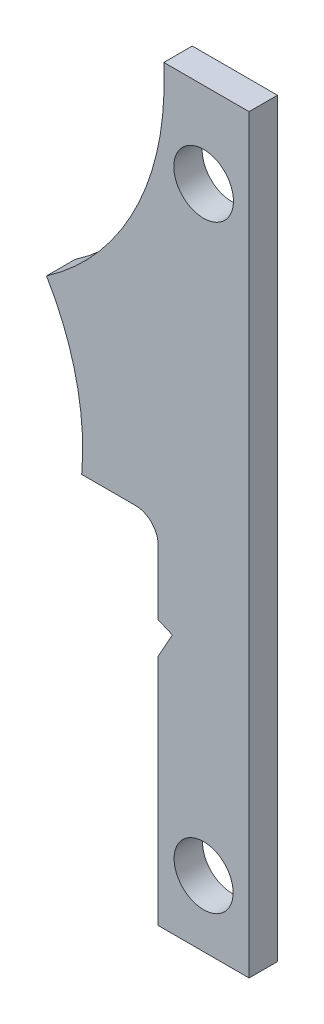
ISO-10303-21;
HEADER;
FILE_DESCRIPTION(('STEP AP214'),'2;1');
FILE_NAME('part.step','',(''),(''),'','','');
FILE_SCHEMA(('AUTOMOTIVE_DESIGN { 1 0 10303 214 1 1 1 1 }'));
ENDSEC;
DATA;
#1=APPLICATION_CONTEXT('core data for automotive mechanical design processes');
#2=APPLICATION_PROTOCOL_DEFINITION('international standard','automotive_design',2000,#1);
#3=PRODUCT_CONTEXT('',#1,'mechanical');
#4=PRODUCT('Part','Part','',(#3));
#5=PRODUCT_RELATED_PRODUCT_CATEGORY('part','',(#4));
#6=PRODUCT_DEFINITION_FORMATION('','',#4);
#7=PRODUCT_DEFINITION_CONTEXT('part definition',#1,'design');
#8=PRODUCT_DEFINITION('design','',#6,#7);
#9=PRODUCT_DEFINITION_SHAPE('','',#8);
#10=(LENGTH_UNIT() NAMED_UNIT(*) SI_UNIT(.MILLI.,.METRE.));
#11=(NAMED_UNIT(*) PLANE_ANGLE_UNIT() SI_UNIT($,.RADIAN.));
#12=(NAMED_UNIT(*) SI_UNIT($,.STERADIAN.) SOLID_ANGLE_UNIT());
#13=UNCERTAINTY_MEASURE_WITH_UNIT(LENGTH_MEASURE(1.E-05),#10,'distance_accuracy_value','');
#14=(GEOMETRIC_REPRESENTATION_CONTEXT(3) GLOBAL_UNCERTAINTY_ASSIGNED_CONTEXT((#13)) GLOBAL_UNIT_ASSIGNED_CONTEXT((#10,
#11,#12)) REPRESENTATION_CONTEXT('',''));
#15=CARTESIAN_POINT('',(0.,0.,0.));
#16=DIRECTION('',(0.,0.,1.));
#17=DIRECTION('',(1.,0.,0.));
#18=AXIS2_PLACEMENT_3D('',#15,#16,#17);
#19=CARTESIAN_POINT('',(795.076378776782,63.8094152835061,5.));
#20=DIRECTION('',(0.,0.,1.));
#21=DIRECTION('',(1.,0.,0.));
#22=AXIS2_PLACEMENT_3D('',#19,#20,#21);
#23=PLANE('',#22);
#24=CARTESIAN_POINT('',(795.076378776782,63.8094152835061,5.));
#25=DIRECTION('',(0.,0.,1.));
#26=DIRECTION('',(1.,0.,0.));
#27=AXIS2_PLACEMENT_3D('',#24,#25,#26);
#28=CIRCLE('',#27,45.25);
#29=CARTESIAN_POINT('',(840.148400329433,59.8000047087006,5.));
#30=VERTEX_POINT('',#29);
#31=CARTESIAN_POINT('',(833.960496434744,86.9521872428422,5.));
#32=VERTEX_POINT('',#31);
#33=EDGE_CURVE('E47',#30,#32,#28,.T.);
#34=ORIENTED_EDGE('',*,*,#33,.F.);
#35=DIRECTION('',(1.,0.,0.));
#36=VECTOR('',#35,1.);
#37=CARTESIAN_POINT('',(820.028101645404,59.8000047086987,5.));
#38=LINE('',#37,#36);
#39=CARTESIAN_POINT('',(849.600001490012,59.8000047087015,5.));
#40=VERTEX_POINT('',#39);
#41=EDGE_CURVE('E101',#30,#40,#38,.T.);
#42=ORIENTED_EDGE('',*,*,#41,.T.);
#43=CARTESIAN_POINT('',(849.600001490012,55.8000047087015,5.));
#44=DIRECTION('',(0.,0.,-1.));
#45=DIRECTION('',(1.,0.,0.));
#46=AXIS2_PLACEMENT_3D('',#43,#44,#45);
#47=CIRCLE('',#46,4.);
#48=CARTESIAN_POINT('',(853.600001490012,55.8000047087015,5.));
#49=VERTEX_POINT('',#48);
#50=EDGE_CURVE('E198',#40,#49,#47,.T.);
#51=ORIENTED_EDGE('',*,*,#50,.T.);
#52=DIRECTION('',(0.,-1.,0.));
#53=VECTOR('',#52,1.);
#54=CARTESIAN_POINT('',(853.600001490012,55.8000047087015,5.));
#55=LINE('',#54,#53);
#56=CARTESIAN_POINT('',(853.600001490012,44.4001544028015,5.));
#57=VERTEX_POINT('',#56);
#58=EDGE_CURVE('E220',#49,#57,#55,.T.);
#59=ORIENTED_EDGE('',*,*,#58,.T.);
#60=DIRECTION('',(0.915294684400679,-0.402784856601961,0.));
#61=VECTOR('',#60,1.);
#62=CARTESIAN_POINT('',(853.600001490012,44.4001544028015,5.));
#63=LINE('',#62,#61);
#64=CARTESIAN_POINT('',(856.099999798813,43.3000043883015,5.));
#65=VERTEX_POINT('',#64);
#66=EDGE_CURVE('E217',#57,#65,#63,.T.);
#67=ORIENTED_EDGE('',*,*,#66,.T.);
#68=DIRECTION('',(-0.488075249911389,-0.872801552716272,0.));
#69=VECTOR('',#68,1.);
#70=CARTESIAN_POINT('',(856.099999798813,43.3000043883015,5.));
#71=LINE('',#70,#69);
#72=CARTESIAN_POINT('',(853.600001490012,38.8293773567015,5.));
#73=VERTEX_POINT('',#72);
#74=EDGE_CURVE('E219',#65,#73,#71,.T.);
#75=ORIENTED_EDGE('',*,*,#74,.T.);
#76=DIRECTION('',(0.,-1.,0.));
#77=VECTOR('',#76,1.);
#78=CARTESIAN_POINT('',(853.600001490012,38.8293773567015,5.));
#79=LINE('',#78,#77);
#80=CARTESIAN_POINT('',(853.600001490012,-2.19999390319852,5.));
#81=VERTEX_POINT('',#80);
#82=EDGE_CURVE('E222',#73,#81,#79,.T.);
#83=ORIENTED_EDGE('',*,*,#82,.T.);
#84=DIRECTION('',(1.,0.,0.));
#85=VECTOR('',#84,1.);
#86=CARTESIAN_POINT('',(853.600001490012,-2.19999390319852,5.));
#87=LINE('',#86,#85);
#88=CARTESIAN_POINT('',(869.600000000013,-2.19999390319852,5.));
#89=VERTEX_POINT('',#88);
#90=EDGE_CURVE('E130',#81,#89,#87,.T.);
#91=ORIENTED_EDGE('',*,*,#90,.T.);
#92=DIRECTION('',(0.,1.,0.));
#93=VECTOR('',#92,1.);
#94=CARTESIAN_POINT('',(869.600000000013,-2.19999390319852,5.));
#95=LINE('',#94,#93);
#96=CARTESIAN_POINT('',(869.600000000013,129.800004708701,5.));
#97=VERTEX_POINT('',#96);
#98=EDGE_CURVE('E123',#89,#97,#95,.T.);
#99=ORIENTED_EDGE('',*,*,#98,.T.);
#100=DIRECTION('',(-1.,0.,0.));
#101=VECTOR('',#100,1.);
#102=CARTESIAN_POINT('',(869.600000000013,129.800004708701,5.));
#103=LINE('',#102,#101);
#104=CARTESIAN_POINT('',(854.600000000013,129.800004708701,5.));
#105=VERTEX_POINT('',#104);
#106=EDGE_CURVE('E127',#97,#105,#103,.T.);
#107=ORIENTED_EDGE('',*,*,#106,.T.);
#108=DIRECTION('',(0.,-1.,0.));
#109=VECTOR('',#108,1.);
#110=CARTESIAN_POINT('',(854.600000000013,129.800004708701,5.));
#111=LINE('',#110,#109);
#112=CARTESIAN_POINT('',(854.600000000013,124.800004708701,5.));
#113=VERTEX_POINT('',#112);
#114=EDGE_CURVE('E55',#105,#113,#111,.T.);
#115=ORIENTED_EDGE('',*,*,#114,.T.);
#116=CARTESIAN_POINT('',(806.723142878147,126.35706585599,5.));
#117=DIRECTION('',(0.,0.,-1.));
#118=DIRECTION('',(1.,0.,0.));
#119=AXIS2_PLACEMENT_3D('',#116,#117,#118);
#120=CIRCLE('',#119,47.9021699642505);
#121=EDGE_CURVE('E147',#113,#32,#120,.T.);
#122=ORIENTED_EDGE('',*,*,#121,.T.);
#123=EDGE_LOOP('',(#34,#42,#51,#59,#67,#75,#83,#91,#99,#107,#115,#122));
#124=FACE_BOUND('',#123,.T.);
#125=CARTESIAN_POINT('',(861.600000000013,9.39149717140147,5.));
#126=DIRECTION('',(0.,0.,1.));
#127=DIRECTION('',(1.,0.,0.));
#128=AXIS2_PLACEMENT_3D('',#125,#126,#127);
#129=CIRCLE('',#128,5.19190313570428);
#130=CARTESIAN_POINT('',(866.791903135717,9.39149717140147,5.));
#131=VERTEX_POINT('',#130);
#132=EDGE_CURVE('E156',#131,#131,#129,.T.);
#133=ORIENTED_EDGE('',*,*,#132,.F.);
#134=EDGE_LOOP('',(#133));
#135=FACE_BOUND('',#134,.T.);
#136=CARTESIAN_POINT('',(861.600000000013,114.800004708701,5.));
#137=DIRECTION('',(0.,0.,1.));
#138=DIRECTION('',(1.,0.,0.));
#139=AXIS2_PLACEMENT_3D('',#136,#137,#138);
#140=CIRCLE('',#139,5.24999999999987);
#141=CARTESIAN_POINT('',(866.850000000012,114.800004708701,5.));
#142=VERTEX_POINT('',#141);
#143=EDGE_CURVE('E250',#142,#142,#140,.T.);
#144=ORIENTED_EDGE('',*,*,#143,.F.);
#145=EDGE_LOOP('',(#144));
#146=FACE_BOUND('',#145,.T.);
#147=ADVANCED_FACE('F32',(#124,#135,#146),#23,.T.);
#148=CARTESIAN_POINT('',(795.076378776782,63.8094152835061,0.));
#149=DIRECTION('',(0.,0.,1.));
#150=DIRECTION('',(1.,0.,0.));
#151=AXIS2_PLACEMENT_3D('',#148,#149,#150);
#152=PLANE('',#151);
#153=DIRECTION('',(1.,0.,0.));
#154=VECTOR('',#153,1.);
#155=CARTESIAN_POINT('',(820.028101645404,59.8000047086987,0.));
#156=LINE('',#155,#154);
#157=CARTESIAN_POINT('',(840.148400329433,59.8000047087006,0.));
#158=VERTEX_POINT('',#157);
#159=CARTESIAN_POINT('',(849.600001490012,59.8000047087015,0.));
#160=VERTEX_POINT('',#159);
#161=EDGE_CURVE('E153',#158,#160,#156,.T.);
#162=ORIENTED_EDGE('',*,*,#161,.F.);
#163=CARTESIAN_POINT('',(795.076378776782,63.8094152835061,0.));
#164=DIRECTION('',(0.,0.,-1.));
#165=DIRECTION('',(-1.,0.,0.));
#166=AXIS2_PLACEMENT_3D('',#163,#164,#165);
#167=CIRCLE('',#166,45.25);
#168=CARTESIAN_POINT('',(833.960496434744,86.9521872428422,0.));
#169=VERTEX_POINT('',#168);
#170=EDGE_CURVE('E242',#169,#158,#167,.T.);
#171=ORIENTED_EDGE('',*,*,#170,.F.);
#172=CARTESIAN_POINT('',(806.723142878147,126.35706585599,0.));
#173=DIRECTION('',(0.,0.,-1.));
#174=DIRECTION('',(1.,0.,0.));
#175=AXIS2_PLACEMENT_3D('',#172,#173,#174);
#176=CIRCLE('',#175,47.9021699642505);
#177=CARTESIAN_POINT('',(854.600000000013,124.800004708701,0.));
#178=VERTEX_POINT('',#177);
#179=EDGE_CURVE('E172',#178,#169,#176,.T.);
#180=ORIENTED_EDGE('',*,*,#179,.F.);
#181=DIRECTION('',(0.,-1.,0.));
#182=VECTOR('',#181,1.);
#183=CARTESIAN_POINT('',(854.600000000013,129.800004708701,0.));
#184=LINE('',#183,#182);
#185=CARTESIAN_POINT('',(854.600000000013,129.800004708701,0.));
#186=VERTEX_POINT('',#185);
#187=EDGE_CURVE('E94',#186,#178,#184,.T.);
#188=ORIENTED_EDGE('',*,*,#187,.F.);
#189=DIRECTION('',(-1.,0.,0.));
#190=VECTOR('',#189,1.);
#191=CARTESIAN_POINT('',(869.600000000013,129.800004708701,0.));
#192=LINE('',#191,#190);
#193=CARTESIAN_POINT('',(869.600000000013,129.800004708701,0.));
#194=VERTEX_POINT('',#193);
#195=EDGE_CURVE('E169',#194,#186,#192,.T.);
#196=ORIENTED_EDGE('',*,*,#195,.F.);
#197=DIRECTION('',(0.,1.,0.));
#198=VECTOR('',#197,1.);
#199=CARTESIAN_POINT('',(869.600000000013,-2.19999390319852,0.));
#200=LINE('',#199,#198);
#201=CARTESIAN_POINT('',(869.600000000013,-2.19999390319852,0.));
#202=VERTEX_POINT('',#201);
#203=EDGE_CURVE('E139',#202,#194,#200,.T.);
#204=ORIENTED_EDGE('',*,*,#203,.F.);
#205=DIRECTION('',(1.,0.,0.));
#206=VECTOR('',#205,1.);
#207=CARTESIAN_POINT('',(853.600001490012,-2.19999390319852,0.));
#208=LINE('',#207,#206);
#209=CARTESIAN_POINT('',(853.600001490012,-2.19999390319852,0.));
#210=VERTEX_POINT('',#209);
#211=EDGE_CURVE('E166',#210,#202,#208,.T.);
#212=ORIENTED_EDGE('',*,*,#211,.F.);
#213=DIRECTION('',(0.,-1.,0.));
#214=VECTOR('',#213,1.);
#215=CARTESIAN_POINT('',(853.600001490012,38.8293773567015,0.));
#216=LINE('',#215,#214);
#217=CARTESIAN_POINT('',(853.600001490012,38.8293773567015,0.));
#218=VERTEX_POINT('',#217);
#219=EDGE_CURVE('E164',#218,#210,#216,.T.);
#220=ORIENTED_EDGE('',*,*,#219,.F.);
#221=DIRECTION('',(-0.488075249911389,-0.872801552716272,0.));
#222=VECTOR('',#221,1.);
#223=CARTESIAN_POINT('',(856.099999798813,43.3000043883015,0.));
#224=LINE('',#223,#222);
#225=CARTESIAN_POINT('',(856.099999798813,43.3000043883015,0.));
#226=VERTEX_POINT('',#225);
#227=EDGE_CURVE('E162',#226,#218,#224,.T.);
#228=ORIENTED_EDGE('',*,*,#227,.F.);
#229=DIRECTION('',(0.915294684400679,-0.402784856601961,0.));
#230=VECTOR('',#229,1.);
#231=CARTESIAN_POINT('',(853.600001490012,44.4001544028015,0.));
#232=LINE('',#231,#230);
#233=CARTESIAN_POINT('',(853.600001490012,44.4001544028015,0.));
#234=VERTEX_POINT('',#233);
#235=EDGE_CURVE('E160',#234,#226,#232,.T.);
#236=ORIENTED_EDGE('',*,*,#235,.F.);
#237=DIRECTION('',(0.,-1.,0.));
#238=VECTOR('',#237,1.);
#239=CARTESIAN_POINT('',(853.600001490012,55.8000047087015,0.));
#240=LINE('',#239,#238);
#241=CARTESIAN_POINT('',(853.600001490012,55.8000047087015,0.));
#242=VERTEX_POINT('',#241);
#243=EDGE_CURVE('E158',#242,#234,#240,.T.);
#244=ORIENTED_EDGE('',*,*,#243,.F.);
#245=CARTESIAN_POINT('',(849.600001490012,55.8000047087015,0.));
#246=DIRECTION('',(0.,0.,-1.));
#247=DIRECTION('',(1.,0.,0.));
#248=AXIS2_PLACEMENT_3D('',#245,#246,#247);
#249=CIRCLE('',#248,4.);
#250=EDGE_CURVE('E155',#160,#242,#249,.T.);
#251=ORIENTED_EDGE('',*,*,#250,.F.);
#252=EDGE_LOOP('',(#162,#171,#180,#188,#196,#204,#212,#220,#228,#236,#244,#251));
#253=FACE_BOUND('',#252,.T.);
#254=CARTESIAN_POINT('',(861.600000000013,9.39149717140147,0.));
#255=DIRECTION('',(0.,0.,1.));
#256=DIRECTION('',(1.,0.,0.));
#257=AXIS2_PLACEMENT_3D('',#254,#255,#256);
#258=CIRCLE('',#257,5.19190313570428);
#259=CARTESIAN_POINT('',(866.791903135717,9.39149717140147,0.));
#260=VERTEX_POINT('',#259);
#261=EDGE_CURVE('E247',#260,#260,#258,.T.);
#262=ORIENTED_EDGE('',*,*,#261,.T.);
#263=EDGE_LOOP('',(#262));
#264=FACE_BOUND('',#263,.T.);
#265=CARTESIAN_POINT('',(861.600000000013,114.800004708701,0.));
#266=DIRECTION('',(0.,0.,1.));
#267=DIRECTION('',(1.,0.,0.));
#268=AXIS2_PLACEMENT_3D('',#265,#266,#267);
#269=CIRCLE('',#268,5.24999999999987);
#270=CARTESIAN_POINT('',(866.850000000012,114.800004708701,0.));
#271=VERTEX_POINT('',#270);
#272=EDGE_CURVE('E253',#271,#271,#269,.T.);
#273=ORIENTED_EDGE('',*,*,#272,.T.);
#274=EDGE_LOOP('',(#273));
#275=FACE_BOUND('',#274,.T.);
#276=ADVANCED_FACE('F203',(#253,#264,#275),#152,.F.);
#277=CARTESIAN_POINT('',(820.028101645404,59.8000047086987,5.));
#278=DIRECTION('',(0.,1.,0.));
#279=DIRECTION('',(-1.,0.,0.));
#280=AXIS2_PLACEMENT_3D('',#277,#278,#279);
#281=PLANE('',#280);
#282=ORIENTED_EDGE('',*,*,#41,.F.);
#283=DIRECTION('',(0.,0.,-1.));
#284=VECTOR('',#283,1.);
#285=CARTESIAN_POINT('',(840.148400329433,59.8000047087006,6.));
#286=LINE('',#285,#284);
#287=EDGE_CURVE('E241',#30,#158,#286,.T.);
#288=ORIENTED_EDGE('',*,*,#287,.T.);
#289=ORIENTED_EDGE('',*,*,#161,.T.);
#290=DIRECTION('',(0.,0.,-1.));
#291=VECTOR('',#290,1.);
#292=CARTESIAN_POINT('',(849.600001490012,59.8000047087015,5.));
#293=LINE('',#292,#291);
#294=EDGE_CURVE('E40',#40,#160,#293,.T.);
#295=ORIENTED_EDGE('',*,*,#294,.F.);
#296=EDGE_LOOP('',(#282,#288,#289,#295));
#297=FACE_BOUND('',#296,.T.);
#298=ADVANCED_FACE('F34',(#297),#281,.F.);
#299=CARTESIAN_POINT('',(849.600001490012,55.8000047087015,5.));
#300=DIRECTION('',(0.,0.,-1.));
#301=DIRECTION('',(-1.,0.,0.));
#302=AXIS2_PLACEMENT_3D('',#299,#300,#301);
#303=CYLINDRICAL_SURFACE('',#302,4.);
#304=ORIENTED_EDGE('',*,*,#250,.T.);
#305=DIRECTION('',(0.,0.,-1.));
#306=VECTOR('',#305,1.);
#307=CARTESIAN_POINT('',(853.600001490012,55.8000047087015,5.));
#308=LINE('',#307,#306);
#309=EDGE_CURVE('E190',#49,#242,#308,.T.);
#310=ORIENTED_EDGE('',*,*,#309,.F.);
#311=ORIENTED_EDGE('',*,*,#50,.F.);
#312=ORIENTED_EDGE('',*,*,#294,.T.);
#313=EDGE_LOOP('',(#304,#310,#311,#312));
#314=FACE_BOUND('',#313,.T.);
#315=ADVANCED_FACE('F196',(#314),#303,.F.);
#316=CARTESIAN_POINT('',(853.600001490012,55.8000047087015,5.));
#317=DIRECTION('',(1.,0.,0.));
#318=DIRECTION('',(0.,0.,-1.));
#319=AXIS2_PLACEMENT_3D('',#316,#317,#318);
#320=PLANE('',#319);
#321=ORIENTED_EDGE('',*,*,#243,.T.);
#322=DIRECTION('',(0.,0.,-1.));
#323=VECTOR('',#322,1.);
#324=CARTESIAN_POINT('',(853.600001490012,44.4001544028015,5.));
#325=LINE('',#324,#323);
#326=EDGE_CURVE('E187',#57,#234,#325,.T.);
#327=ORIENTED_EDGE('',*,*,#326,.F.);
#328=ORIENTED_EDGE('',*,*,#58,.F.);
#329=ORIENTED_EDGE('',*,*,#309,.T.);
#330=EDGE_LOOP('',(#321,#327,#328,#329));
#331=FACE_BOUND('',#330,.T.);
#332=ADVANCED_FACE('F211',(#331),#320,.F.);
#333=CARTESIAN_POINT('',(853.600001490012,44.4001544028015,5.));
#334=DIRECTION('',(0.402784856601961,0.915294684400679,0.));
#335=DIRECTION('',(-0.915294684400679,0.402784856601961,0.));
#336=AXIS2_PLACEMENT_3D('',#333,#334,#335);
#337=PLANE('',#336);
#338=ORIENTED_EDGE('',*,*,#235,.T.);
#339=DIRECTION('',(0.,0.,-1.));
#340=VECTOR('',#339,1.);
#341=CARTESIAN_POINT('',(856.099999798813,43.3000043883015,5.));
#342=LINE('',#341,#340);
#343=EDGE_CURVE('E184',#65,#226,#342,.T.);
#344=ORIENTED_EDGE('',*,*,#343,.F.);
#345=ORIENTED_EDGE('',*,*,#66,.F.);
#346=ORIENTED_EDGE('',*,*,#326,.T.);
#347=EDGE_LOOP('',(#338,#344,#345,#346));
#348=FACE_BOUND('',#347,.T.);
#349=ADVANCED_FACE('F215',(#348),#337,.F.);
#350=CARTESIAN_POINT('',(856.099999798813,43.3000043883015,5.));
#351=DIRECTION('',(0.872801552716272,-0.488075249911389,0.));
#352=DIRECTION('',(0.488075249911389,0.872801552716272,0.));
#353=AXIS2_PLACEMENT_3D('',#350,#351,#352);
#354=PLANE('',#353);
#355=ORIENTED_EDGE('',*,*,#227,.T.);
#356=DIRECTION('',(0.,0.,-1.));
#357=VECTOR('',#356,1.);
#358=CARTESIAN_POINT('',(853.600001490012,38.8293773567015,5.));
#359=LINE('',#358,#357);
#360=EDGE_CURVE('E181',#73,#218,#359,.T.);
#361=ORIENTED_EDGE('',*,*,#360,.F.);
#362=ORIENTED_EDGE('',*,*,#74,.F.);
#363=ORIENTED_EDGE('',*,*,#343,.T.);
#364=EDGE_LOOP('',(#355,#361,#362,#363));
#365=FACE_BOUND('',#364,.T.);
#366=ADVANCED_FACE('F293',(#365),#354,.F.);
#367=CARTESIAN_POINT('',(853.600001490012,38.8293773567015,5.));
#368=DIRECTION('',(1.,0.,0.));
#369=DIRECTION('',(0.,0.,-1.));
#370=AXIS2_PLACEMENT_3D('',#367,#368,#369);
#371=PLANE('',#370);
#372=ORIENTED_EDGE('',*,*,#219,.T.);
#373=DIRECTION('',(0.,0.,-1.));
#374=VECTOR('',#373,1.);
#375=CARTESIAN_POINT('',(853.600001490012,-2.19999390319852,5.));
#376=LINE('',#375,#374);
#377=EDGE_CURVE('E178',#81,#210,#376,.T.);
#378=ORIENTED_EDGE('',*,*,#377,.F.);
#379=ORIENTED_EDGE('',*,*,#82,.F.);
#380=ORIENTED_EDGE('',*,*,#360,.T.);
#381=EDGE_LOOP('',(#372,#378,#379,#380));
#382=FACE_BOUND('',#381,.T.);
#383=ADVANCED_FACE('F231',(#382),#371,.F.);
#384=CARTESIAN_POINT('',(853.600001490012,-2.19999390319852,5.));
#385=DIRECTION('',(0.,1.,0.));
#386=DIRECTION('',(0.,0.,1.));
#387=AXIS2_PLACEMENT_3D('',#384,#385,#386);
#388=PLANE('',#387);
#389=ORIENTED_EDGE('',*,*,#211,.T.);
#390=DIRECTION('',(0.,0.,-1.));
#391=VECTOR('',#390,1.);
#392=CARTESIAN_POINT('',(869.600000000013,-2.19999390319852,5.));
#393=LINE('',#392,#391);
#394=EDGE_CURVE('E142',#89,#202,#393,.T.);
#395=ORIENTED_EDGE('',*,*,#394,.F.);
#396=ORIENTED_EDGE('',*,*,#90,.F.);
#397=ORIENTED_EDGE('',*,*,#377,.T.);
#398=EDGE_LOOP('',(#389,#395,#396,#397));
#399=FACE_BOUND('',#398,.T.);
#400=ADVANCED_FACE('F235',(#399),#388,.F.);
#401=CARTESIAN_POINT('',(869.600000000013,-2.19999390319852,5.));
#402=DIRECTION('',(-1.,0.,0.));
#403=DIRECTION('',(0.,0.,1.));
#404=AXIS2_PLACEMENT_3D('',#401,#402,#403);
#405=PLANE('',#404);
#406=ORIENTED_EDGE('',*,*,#203,.T.);
#407=DIRECTION('',(0.,0.,-1.));
#408=VECTOR('',#407,1.);
#409=CARTESIAN_POINT('',(869.600000000013,129.800004708701,5.));
#410=LINE('',#409,#408);
#411=EDGE_CURVE('E136',#97,#194,#410,.T.);
#412=ORIENTED_EDGE('',*,*,#411,.F.);
#413=ORIENTED_EDGE('',*,*,#98,.F.);
#414=ORIENTED_EDGE('',*,*,#394,.T.);
#415=EDGE_LOOP('',(#406,#412,#413,#414));
#416=FACE_BOUND('',#415,.T.);
#417=ADVANCED_FACE('F137',(#416),#405,.F.);
#418=CARTESIAN_POINT('',(869.600000000013,129.800004708701,5.));
#419=DIRECTION('',(0.,-1.,0.));
#420=DIRECTION('',(0.,0.,-1.));
#421=AXIS2_PLACEMENT_3D('',#418,#419,#420);
#422=PLANE('',#421);
#423=ORIENTED_EDGE('',*,*,#195,.T.);
#424=DIRECTION('',(0.,0.,-1.));
#425=VECTOR('',#424,1.);
#426=CARTESIAN_POINT('',(854.600000000013,129.800004708701,5.));
#427=LINE('',#426,#425);
#428=EDGE_CURVE('E143',#105,#186,#427,.T.);
#429=ORIENTED_EDGE('',*,*,#428,.F.);
#430=ORIENTED_EDGE('',*,*,#106,.F.);
#431=ORIENTED_EDGE('',*,*,#411,.T.);
#432=EDGE_LOOP('',(#423,#429,#430,#431));
#433=FACE_BOUND('',#432,.T.);
#434=ADVANCED_FACE('F145',(#433),#422,.F.);
#435=CARTESIAN_POINT('',(854.600000000013,129.800004708701,5.));
#436=DIRECTION('',(1.,0.,0.));
#437=DIRECTION('',(0.,0.,-1.));
#438=AXIS2_PLACEMENT_3D('',#435,#436,#437);
#439=PLANE('',#438);
#440=ORIENTED_EDGE('',*,*,#187,.T.);
#441=DIRECTION('',(0.,0.,-1.));
#442=VECTOR('',#441,1.);
#443=CARTESIAN_POINT('',(854.600000000013,124.800004708701,5.));
#444=LINE('',#443,#442);
#445=EDGE_CURVE('E152',#113,#178,#444,.T.);
#446=ORIENTED_EDGE('',*,*,#445,.F.);
#447=ORIENTED_EDGE('',*,*,#114,.F.);
#448=ORIENTED_EDGE('',*,*,#428,.T.);
#449=EDGE_LOOP('',(#440,#446,#447,#448));
#450=FACE_BOUND('',#449,.T.);
#451=ADVANCED_FACE('F237',(#450),#439,.F.);
#452=CARTESIAN_POINT('',(806.723142878147,126.35706585599,5.));
#453=DIRECTION('',(0.,0.,-1.));
#454=DIRECTION('',(-1.,0.,0.));
#455=AXIS2_PLACEMENT_3D('',#452,#453,#454);
#456=CYLINDRICAL_SURFACE('',#455,47.9021699642505);
#457=ORIENTED_EDGE('',*,*,#179,.T.);
#458=DIRECTION('',(0.,0.,-1.));
#459=VECTOR('',#458,1.);
#460=CARTESIAN_POINT('',(833.960496434744,86.9521872428422,3.));
#461=LINE('',#460,#459);
#462=EDGE_CURVE('E11',#169,#32,#461,.F.);
#463=ORIENTED_EDGE('',*,*,#462,.T.);
#464=ORIENTED_EDGE('',*,*,#121,.F.);
#465=ORIENTED_EDGE('',*,*,#445,.T.);
#466=EDGE_LOOP('',(#457,#463,#464,#465));
#467=FACE_BOUND('',#466,.T.);
#468=ADVANCED_FACE('F240',(#467),#456,.F.);
#469=CARTESIAN_POINT('',(861.600000000013,9.39149717140147,5.));
#470=DIRECTION('',(0.,0.,-1.));
#471=DIRECTION('',(-1.,0.,0.));
#472=AXIS2_PLACEMENT_3D('',#469,#470,#471);
#473=CYLINDRICAL_SURFACE('',#472,5.19190313570428);
#474=ORIENTED_EDGE('',*,*,#132,.T.);
#475=EDGE_LOOP('',(#474));
#476=FACE_BOUND('',#475,.T.);
#477=ORIENTED_EDGE('',*,*,#261,.F.);
#478=EDGE_LOOP('',(#477));
#479=FACE_BOUND('',#478,.T.);
#480=ADVANCED_FACE('F269',(#476,#479),#473,.F.);
#481=CARTESIAN_POINT('',(861.600000000013,114.800004708701,5.));
#482=DIRECTION('',(0.,0.,-1.));
#483=DIRECTION('',(-1.,0.,0.));
#484=AXIS2_PLACEMENT_3D('',#481,#482,#483);
#485=CYLINDRICAL_SURFACE('',#484,5.24999999999987);
#486=ORIENTED_EDGE('',*,*,#143,.T.);
#487=EDGE_LOOP('',(#486));
#488=FACE_BOUND('',#487,.T.);
#489=ORIENTED_EDGE('',*,*,#272,.F.);
#490=EDGE_LOOP('',(#489));
#491=FACE_BOUND('',#490,.T.);
#492=ADVANCED_FACE('F264',(#488,#491),#485,.F.);
#493=CARTESIAN_POINT('',(795.076378776782,63.8094152835061,6.));
#494=DIRECTION('',(0.,0.,-1.));
#495=DIRECTION('',(-1.,0.,0.));
#496=AXIS2_PLACEMENT_3D('',#493,#494,#495);
#497=CYLINDRICAL_SURFACE('',#496,45.25);
#498=ORIENTED_EDGE('',*,*,#33,.T.);
#499=ORIENTED_EDGE('',*,*,#462,.F.);
#500=ORIENTED_EDGE('',*,*,#170,.T.);
#501=ORIENTED_EDGE('',*,*,#287,.F.);
#502=EDGE_LOOP('',(#498,#499,#500,#501));
#503=FACE_BOUND('',#502,.T.);
#504=ADVANCED_FACE('F260',(#503),#497,.F.);
#505=CLOSED_SHELL('',(#147,#276,#298,#315,#332,#349,#366,#383,#400,#417,#434,#451,#468,#480,
#492,#504));
#506=MANIFOLD_SOLID_BREP('B2',#505);
#507=ADVANCED_BREP_SHAPE_REPRESENTATION('',(#18,#506),#14);
#508=SHAPE_DEFINITION_REPRESENTATION(#9,#507);
ENDSEC;
END-ISO-10303-21;
